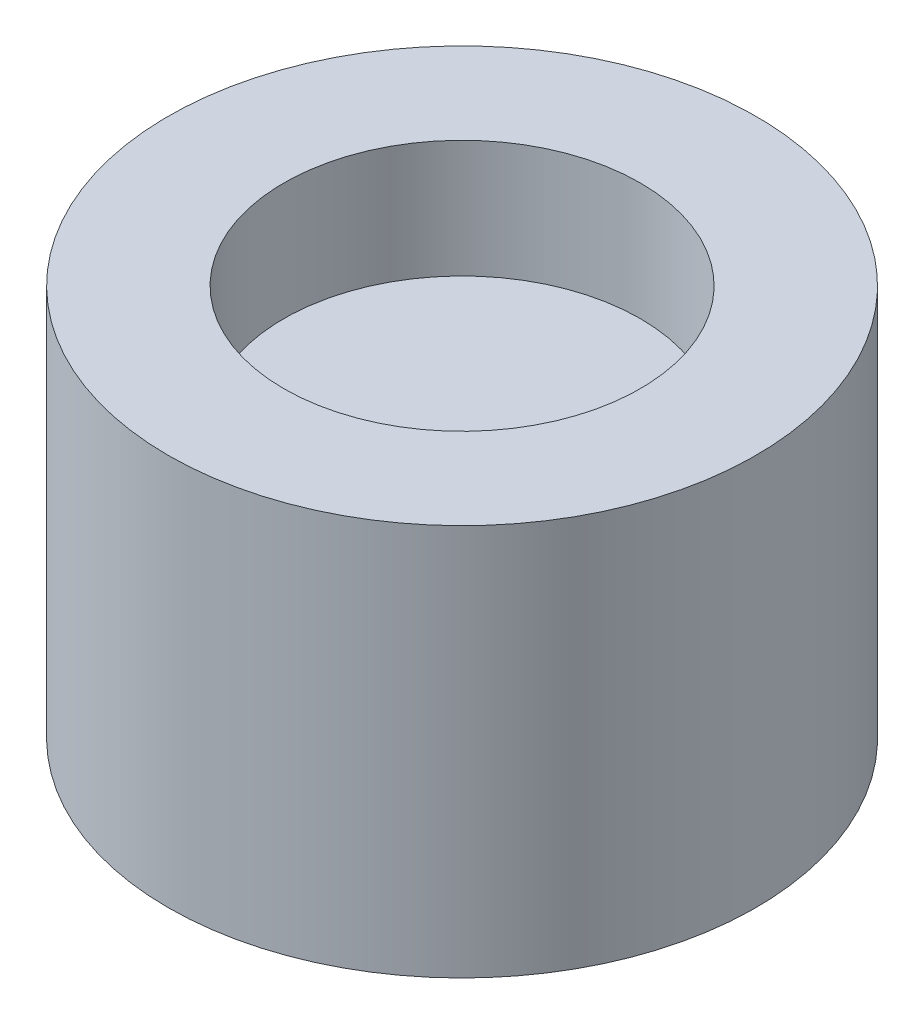
ISO-10303-21;
HEADER;
FILE_DESCRIPTION(('STEP AP214'),'2;1');
FILE_NAME('part.step','',(''),(''),'','','');
FILE_SCHEMA(('AUTOMOTIVE_DESIGN { 1 0 10303 214 1 1 1 1 }'));
ENDSEC;
DATA;
#1=APPLICATION_CONTEXT('core data for automotive mechanical design processes');
#2=APPLICATION_PROTOCOL_DEFINITION('international standard','automotive_design',2000,#1);
#3=PRODUCT_CONTEXT('',#1,'mechanical');
#4=PRODUCT('Part','Part','',(#3));
#5=PRODUCT_RELATED_PRODUCT_CATEGORY('part','',(#4));
#6=PRODUCT_DEFINITION_FORMATION('','',#4);
#7=PRODUCT_DEFINITION_CONTEXT('part definition',#1,'design');
#8=PRODUCT_DEFINITION('design','',#6,#7);
#9=PRODUCT_DEFINITION_SHAPE('','',#8);
#10=(LENGTH_UNIT() NAMED_UNIT(*) SI_UNIT(.MILLI.,.METRE.));
#11=(NAMED_UNIT(*) PLANE_ANGLE_UNIT() SI_UNIT($,.RADIAN.));
#12=(NAMED_UNIT(*) SI_UNIT($,.STERADIAN.) SOLID_ANGLE_UNIT());
#13=UNCERTAINTY_MEASURE_WITH_UNIT(LENGTH_MEASURE(1.E-05),#10,'distance_accuracy_value','');
#14=(GEOMETRIC_REPRESENTATION_CONTEXT(3) GLOBAL_UNCERTAINTY_ASSIGNED_CONTEXT((#13)) GLOBAL_UNIT_ASSIGNED_CONTEXT((#10,
#11,#12)) REPRESENTATION_CONTEXT('',''));
#15=CARTESIAN_POINT('',(0.,0.,0.));
#16=DIRECTION('',(0.,0.,1.));
#17=DIRECTION('',(1.,0.,0.));
#18=AXIS2_PLACEMENT_3D('',#15,#16,#17);
#19=CARTESIAN_POINT('',(0.,10.,0.));
#20=DIRECTION('',(0.,-1.,0.));
#21=DIRECTION('',(0.,0.,-1.));
#22=AXIS2_PLACEMENT_3D('',#19,#20,#21);
#23=CYLINDRICAL_SURFACE('',#22,7.5);
#24=CARTESIAN_POINT('',(0.,10.,0.));
#25=DIRECTION('',(0.,1.,0.));
#26=DIRECTION('',(0.,0.,1.));
#27=AXIS2_PLACEMENT_3D('',#24,#25,#26);
#28=CIRCLE('',#27,7.5);
#29=CARTESIAN_POINT('',(0.,10.,7.5));
#30=VERTEX_POINT('',#29);
#31=EDGE_CURVE('E10',#30,#30,#28,.T.);
#32=ORIENTED_EDGE('',*,*,#31,.F.);
#33=EDGE_LOOP('',(#32));
#34=FACE_BOUND('',#33,.T.);
#35=CARTESIAN_POINT('',(0.,0.,0.));
#36=DIRECTION('',(0.,1.,0.));
#37=DIRECTION('',(0.,0.,1.));
#38=AXIS2_PLACEMENT_3D('',#35,#36,#37);
#39=CIRCLE('',#38,7.5);
#40=CARTESIAN_POINT('',(0.,0.,7.5));
#41=VERTEX_POINT('',#40);
#42=EDGE_CURVE('E34',#41,#41,#39,.T.);
#43=ORIENTED_EDGE('',*,*,#42,.T.);
#44=EDGE_LOOP('',(#43));
#45=FACE_BOUND('',#44,.T.);
#46=ADVANCED_FACE('F31',(#34,#45),#23,.T.);
#47=CARTESIAN_POINT('',(0.,10.,0.));
#48=DIRECTION('',(0.,1.,0.));
#49=DIRECTION('',(0.,0.,1.));
#50=AXIS2_PLACEMENT_3D('',#47,#48,#49);
#51=PLANE('',#50);
#52=CARTESIAN_POINT('',(0.,10.,0.));
#53=DIRECTION('',(0.,1.,0.));
#54=DIRECTION('',(0.,0.,1.));
#55=AXIS2_PLACEMENT_3D('',#52,#53,#54);
#56=CIRCLE('',#55,4.55);
#57=CARTESIAN_POINT('',(0.,10.,4.55));
#58=VERTEX_POINT('',#57);
#59=EDGE_CURVE('E43',#58,#58,#56,.T.);
#60=ORIENTED_EDGE('',*,*,#59,.F.);
#61=EDGE_LOOP('',(#60));
#62=FACE_BOUND('',#61,.T.);
#63=ORIENTED_EDGE('',*,*,#31,.T.);
#64=EDGE_LOOP('',(#63));
#65=FACE_BOUND('',#64,.T.);
#66=ADVANCED_FACE('F58',(#62,#65),#51,.T.);
#67=CARTESIAN_POINT('',(0.,0.,0.));
#68=DIRECTION('',(0.,1.,0.));
#69=DIRECTION('',(0.,0.,1.));
#70=AXIS2_PLACEMENT_3D('',#67,#68,#69);
#71=PLANE('',#70);
#72=ORIENTED_EDGE('',*,*,#42,.F.);
#73=EDGE_LOOP('',(#72));
#74=FACE_BOUND('',#73,.T.);
#75=ADVANCED_FACE('F54',(#74),#71,.F.);
#76=CARTESIAN_POINT('',(0.,7.,0.));
#77=DIRECTION('',(0.,1.,0.));
#78=DIRECTION('',(0.,0.,1.));
#79=AXIS2_PLACEMENT_3D('',#76,#77,#78);
#80=CYLINDRICAL_SURFACE('',#79,4.55);
#81=CARTESIAN_POINT('',(0.,7.,0.));
#82=DIRECTION('',(0.,1.,0.));
#83=DIRECTION('',(0.,0.,1.));
#84=AXIS2_PLACEMENT_3D('',#81,#82,#83);
#85=CIRCLE('',#84,4.55);
#86=CARTESIAN_POINT('',(0.,7.,4.55));
#87=VERTEX_POINT('',#86);
#88=EDGE_CURVE('E41',#87,#87,#85,.T.);
#89=ORIENTED_EDGE('',*,*,#88,.F.);
#90=EDGE_LOOP('',(#89));
#91=FACE_BOUND('',#90,.T.);
#92=ORIENTED_EDGE('',*,*,#59,.T.);
#93=EDGE_LOOP('',(#92));
#94=FACE_BOUND('',#93,.T.);
#95=ADVANCED_FACE('F51',(#91,#94),#80,.F.);
#96=CARTESIAN_POINT('',(0.,7.,0.));
#97=DIRECTION('',(0.,1.,0.));
#98=DIRECTION('',(0.,0.,1.));
#99=AXIS2_PLACEMENT_3D('',#96,#97,#98);
#100=PLANE('',#99);
#101=ORIENTED_EDGE('',*,*,#88,.T.);
#102=EDGE_LOOP('',(#101));
#103=FACE_BOUND('',#102,.T.);
#104=ADVANCED_FACE('F49',(#103),#100,.T.);
#105=CLOSED_SHELL('',(#46,#66,#75,#95,#104));
#106=MANIFOLD_SOLID_BREP('B2',#105);
#107=ADVANCED_BREP_SHAPE_REPRESENTATION('',(#18,#106),#14);
#108=SHAPE_DEFINITION_REPRESENTATION(#9,#107);
ENDSEC;
END-ISO-10303-21;
